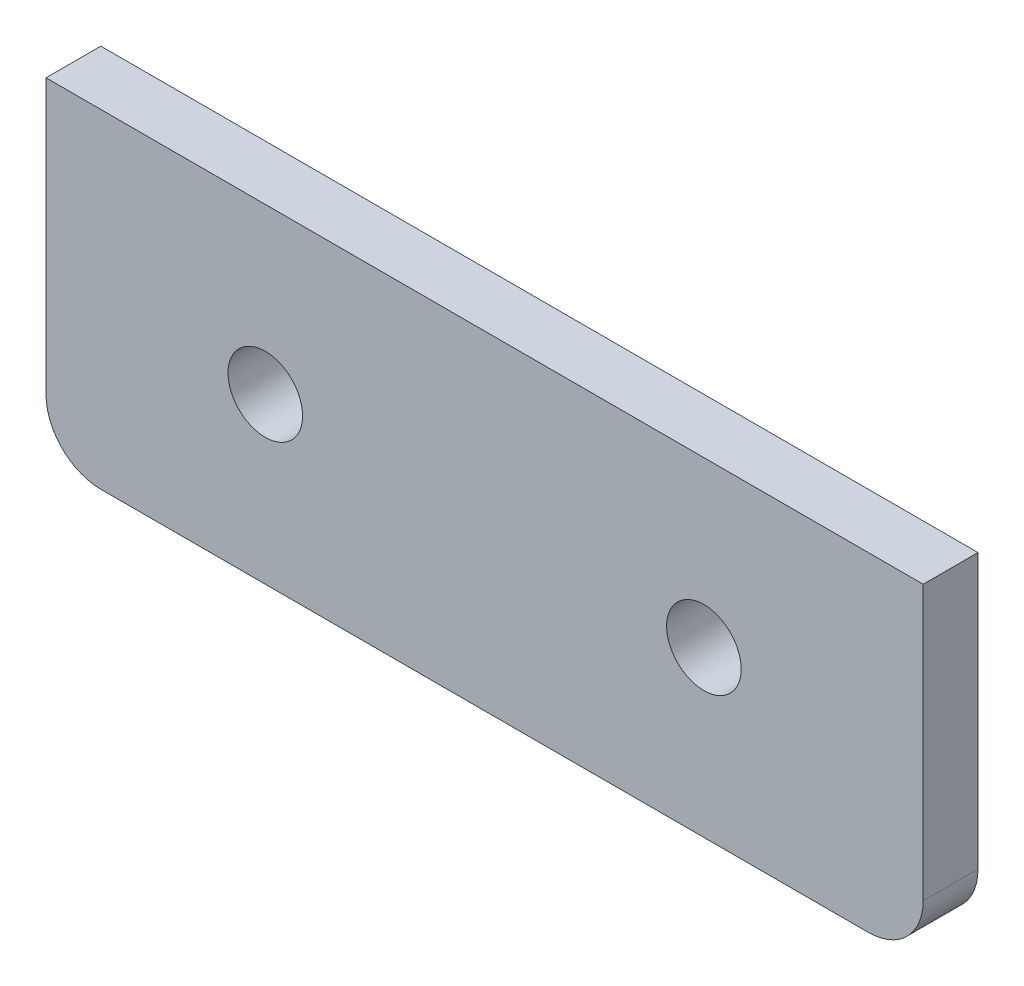
ISO-10303-21;
HEADER;
FILE_DESCRIPTION(('STEP AP214'),'2;1');
FILE_NAME('part.step','',(''),(''),'','','');
FILE_SCHEMA(('AUTOMOTIVE_DESIGN { 1 0 10303 214 1 1 1 1 }'));
ENDSEC;
DATA;
#1=APPLICATION_CONTEXT('core data for automotive mechanical design processes');
#2=APPLICATION_PROTOCOL_DEFINITION('international standard','automotive_design',2000,#1);
#3=PRODUCT_CONTEXT('',#1,'mechanical');
#4=PRODUCT('Part','Part','',(#3));
#5=PRODUCT_RELATED_PRODUCT_CATEGORY('part','',(#4));
#6=PRODUCT_DEFINITION_FORMATION('','',#4);
#7=PRODUCT_DEFINITION_CONTEXT('part definition',#1,'design');
#8=PRODUCT_DEFINITION('design','',#6,#7);
#9=PRODUCT_DEFINITION_SHAPE('','',#8);
#10=(LENGTH_UNIT() NAMED_UNIT(*) SI_UNIT(.MILLI.,.METRE.));
#11=(NAMED_UNIT(*) PLANE_ANGLE_UNIT() SI_UNIT($,.RADIAN.));
#12=(NAMED_UNIT(*) SI_UNIT($,.STERADIAN.) SOLID_ANGLE_UNIT());
#13=UNCERTAINTY_MEASURE_WITH_UNIT(LENGTH_MEASURE(1.E-05),#10,'distance_accuracy_value','');
#14=(GEOMETRIC_REPRESENTATION_CONTEXT(3) GLOBAL_UNCERTAINTY_ASSIGNED_CONTEXT((#13)) GLOBAL_UNIT_ASSIGNED_CONTEXT((#10,
#11,#12)) REPRESENTATION_CONTEXT('',''));
#15=CARTESIAN_POINT('',(0.,0.,0.));
#16=DIRECTION('',(0.,0.,1.));
#17=DIRECTION('',(1.,0.,0.));
#18=AXIS2_PLACEMENT_3D('',#15,#16,#17);
#19=CARTESIAN_POINT('',(40.,15.,5.));
#20=DIRECTION('',(-1.,0.,0.));
#21=DIRECTION('',(0.,-1.,0.));
#22=AXIS2_PLACEMENT_3D('',#19,#20,#21);
#23=PLANE('',#22);
#24=DIRECTION('',(0.,1.,0.));
#25=VECTOR('',#24,1.);
#26=CARTESIAN_POINT('',(40.,15.,5.));
#27=LINE('',#26,#25);
#28=CARTESIAN_POINT('',(40.,-10.,5.));
#29=VERTEX_POINT('',#28);
#30=CARTESIAN_POINT('',(40.,15.,5.));
#31=VERTEX_POINT('',#30);
#32=EDGE_CURVE('E99',#29,#31,#27,.T.);
#33=ORIENTED_EDGE('',*,*,#32,.F.);
#34=DIRECTION('',(0.,0.,-1.));
#35=VECTOR('',#34,1.);
#36=CARTESIAN_POINT('',(40.,-10.,5.));
#37=LINE('',#36,#35);
#38=CARTESIAN_POINT('',(40.,-10.,0.));
#39=VERTEX_POINT('',#38);
#40=EDGE_CURVE('E122',#29,#39,#37,.T.);
#41=ORIENTED_EDGE('',*,*,#40,.T.);
#42=DIRECTION('',(0.,1.,0.));
#43=VECTOR('',#42,1.);
#44=CARTESIAN_POINT('',(40.,15.,0.));
#45=LINE('',#44,#43);
#46=CARTESIAN_POINT('',(40.,15.,0.));
#47=VERTEX_POINT('',#46);
#48=EDGE_CURVE('E120',#39,#47,#45,.T.);
#49=ORIENTED_EDGE('',*,*,#48,.T.);
#50=DIRECTION('',(0.,0.,-1.));
#51=VECTOR('',#50,1.);
#52=CARTESIAN_POINT('',(40.,15.,5.));
#53=LINE('',#52,#51);
#54=EDGE_CURVE('E114',#31,#47,#53,.T.);
#55=ORIENTED_EDGE('',*,*,#54,.F.);
#56=EDGE_LOOP('',(#33,#41,#49,#55));
#57=FACE_BOUND('',#56,.T.);
#58=ADVANCED_FACE('F43',(#57),#23,.F.);
#59=CARTESIAN_POINT('',(-40.,15.,5.));
#60=DIRECTION('',(0.,-1.,0.));
#61=DIRECTION('',(0.,0.,-1.));
#62=AXIS2_PLACEMENT_3D('',#59,#60,#61);
#63=PLANE('',#62);
#64=DIRECTION('',(-1.,0.,0.));
#65=VECTOR('',#64,1.);
#66=CARTESIAN_POINT('',(-40.,15.,0.));
#67=LINE('',#66,#65);
#68=CARTESIAN_POINT('',(-40.,15.,0.));
#69=VERTEX_POINT('',#68);
#70=EDGE_CURVE('E156',#47,#69,#67,.T.);
#71=ORIENTED_EDGE('',*,*,#70,.T.);
#72=DIRECTION('',(0.,0.,-1.));
#73=VECTOR('',#72,1.);
#74=CARTESIAN_POINT('',(-40.,15.,5.));
#75=LINE('',#74,#73);
#76=CARTESIAN_POINT('',(-40.,15.,5.));
#77=VERTEX_POINT('',#76);
#78=EDGE_CURVE('E116',#77,#69,#75,.T.);
#79=ORIENTED_EDGE('',*,*,#78,.F.);
#80=DIRECTION('',(-1.,0.,0.));
#81=VECTOR('',#80,1.);
#82=CARTESIAN_POINT('',(-40.,15.,5.));
#83=LINE('',#82,#81);
#84=EDGE_CURVE('E102',#31,#77,#83,.T.);
#85=ORIENTED_EDGE('',*,*,#84,.F.);
#86=ORIENTED_EDGE('',*,*,#54,.T.);
#87=EDGE_LOOP('',(#71,#79,#85,#86));
#88=FACE_BOUND('',#87,.T.);
#89=ADVANCED_FACE('F113',(#88),#63,.F.);
#90=CARTESIAN_POINT('',(-40.,15.,5.));
#91=DIRECTION('',(1.,0.,0.));
#92=DIRECTION('',(0.,1.,0.));
#93=AXIS2_PLACEMENT_3D('',#90,#91,#92);
#94=PLANE('',#93);
#95=DIRECTION('',(0.,-1.,0.));
#96=VECTOR('',#95,1.);
#97=CARTESIAN_POINT('',(-40.,15.,0.));
#98=LINE('',#97,#96);
#99=CARTESIAN_POINT('',(-40.,-10.,0.));
#100=VERTEX_POINT('',#99);
#101=EDGE_CURVE('E158',#69,#100,#98,.T.);
#102=ORIENTED_EDGE('',*,*,#101,.T.);
#103=DIRECTION('',(0.,0.,-1.));
#104=VECTOR('',#103,1.);
#105=CARTESIAN_POINT('',(-40.,-10.,5.));
#106=LINE('',#105,#104);
#107=CARTESIAN_POINT('',(-40.,-10.,5.));
#108=VERTEX_POINT('',#107);
#109=EDGE_CURVE('E11',#100,#108,#106,.F.);
#110=ORIENTED_EDGE('',*,*,#109,.T.);
#111=DIRECTION('',(0.,-1.,0.));
#112=VECTOR('',#111,1.);
#113=CARTESIAN_POINT('',(-40.,15.,5.));
#114=LINE('',#113,#112);
#115=EDGE_CURVE('E117',#77,#108,#114,.T.);
#116=ORIENTED_EDGE('',*,*,#115,.F.);
#117=ORIENTED_EDGE('',*,*,#78,.T.);
#118=EDGE_LOOP('',(#102,#110,#116,#117));
#119=FACE_BOUND('',#118,.T.);
#120=ADVANCED_FACE('F167',(#119),#94,.F.);
#121=CARTESIAN_POINT('',(-40.,-15.,5.));
#122=DIRECTION('',(0.,1.,0.));
#123=DIRECTION('',(0.,0.,1.));
#124=AXIS2_PLACEMENT_3D('',#121,#122,#123);
#125=PLANE('',#124);
#126=DIRECTION('',(1.,0.,0.));
#127=VECTOR('',#126,1.);
#128=CARTESIAN_POINT('',(-40.,-15.,0.));
#129=LINE('',#128,#127);
#130=CARTESIAN_POINT('',(-35.,-15.,0.));
#131=VERTEX_POINT('',#130);
#132=CARTESIAN_POINT('',(35.,-15.,0.));
#133=VERTEX_POINT('',#132);
#134=EDGE_CURVE('E109',#131,#133,#129,.T.);
#135=ORIENTED_EDGE('',*,*,#134,.T.);
#136=DIRECTION('',(0.,0.,-1.));
#137=VECTOR('',#136,1.);
#138=CARTESIAN_POINT('',(35.,-15.,5.));
#139=LINE('',#138,#137);
#140=CARTESIAN_POINT('',(35.,-15.,5.));
#141=VERTEX_POINT('',#140);
#142=EDGE_CURVE('E66',#133,#141,#139,.F.);
#143=ORIENTED_EDGE('',*,*,#142,.T.);
#144=DIRECTION('',(1.,0.,0.));
#145=VECTOR('',#144,1.);
#146=CARTESIAN_POINT('',(-40.,-15.,5.));
#147=LINE('',#146,#145);
#148=CARTESIAN_POINT('',(-35.,-15.,5.));
#149=VERTEX_POINT('',#148);
#150=EDGE_CURVE('E126',#149,#141,#147,.T.);
#151=ORIENTED_EDGE('',*,*,#150,.F.);
#152=DIRECTION('',(0.,0.,-1.));
#153=VECTOR('',#152,1.);
#154=CARTESIAN_POINT('',(-35.,-15.,5.));
#155=LINE('',#154,#153);
#156=EDGE_CURVE('E133',#149,#131,#155,.T.);
#157=ORIENTED_EDGE('',*,*,#156,.T.);
#158=EDGE_LOOP('',(#135,#143,#151,#157));
#159=FACE_BOUND('',#158,.T.);
#160=ADVANCED_FACE('F160',(#159),#125,.F.);
#161=CARTESIAN_POINT('',(0.,0.,5.));
#162=DIRECTION('',(0.,0.,1.));
#163=DIRECTION('',(1.,0.,0.));
#164=AXIS2_PLACEMENT_3D('',#161,#162,#163);
#165=PLANE('',#164);
#166=CARTESIAN_POINT('',(-20.,0.,5.));
#167=DIRECTION('',(0.,0.,1.));
#168=DIRECTION('',(1.,0.,0.));
#169=AXIS2_PLACEMENT_3D('',#166,#167,#168);
#170=CIRCLE('',#169,3.4);
#171=CARTESIAN_POINT('',(-16.6,0.,5.));
#172=VERTEX_POINT('',#171);
#173=EDGE_CURVE('E141',#172,#172,#170,.T.);
#174=ORIENTED_EDGE('',*,*,#173,.F.);
#175=EDGE_LOOP('',(#174));
#176=FACE_BOUND('',#175,.T.);
#177=CARTESIAN_POINT('',(20.,0.,5.));
#178=DIRECTION('',(0.,0.,1.));
#179=DIRECTION('',(1.,0.,0.));
#180=AXIS2_PLACEMENT_3D('',#177,#178,#179);
#181=CIRCLE('',#180,3.4);
#182=CARTESIAN_POINT('',(23.4,0.,5.));
#183=VERTEX_POINT('',#182);
#184=EDGE_CURVE('E146',#183,#183,#181,.T.);
#185=ORIENTED_EDGE('',*,*,#184,.F.);
#186=EDGE_LOOP('',(#185));
#187=FACE_BOUND('',#186,.T.);
#188=ORIENTED_EDGE('',*,*,#150,.T.);
#189=CARTESIAN_POINT('',(35.,-10.,5.));
#190=DIRECTION('',(0.,0.,1.));
#191=DIRECTION('',(1.,0.,0.));
#192=AXIS2_PLACEMENT_3D('',#189,#190,#191);
#193=CIRCLE('',#192,5.);
#194=EDGE_CURVE('E52',#141,#29,#193,.T.);
#195=ORIENTED_EDGE('',*,*,#194,.T.);
#196=ORIENTED_EDGE('',*,*,#32,.T.);
#197=ORIENTED_EDGE('',*,*,#84,.T.);
#198=ORIENTED_EDGE('',*,*,#115,.T.);
#199=CARTESIAN_POINT('',(-35.,-10.,5.));
#200=DIRECTION('',(0.,0.,1.));
#201=DIRECTION('',(1.,0.,0.));
#202=AXIS2_PLACEMENT_3D('',#199,#200,#201);
#203=CIRCLE('',#202,5.);
#204=EDGE_CURVE('E137',#108,#149,#203,.T.);
#205=ORIENTED_EDGE('',*,*,#204,.T.);
#206=EDGE_LOOP('',(#188,#195,#196,#197,#198,#205));
#207=FACE_BOUND('',#206,.T.);
#208=ADVANCED_FACE('F101',(#176,#187,#207),#165,.T.);
#209=CARTESIAN_POINT('',(0.,0.,0.));
#210=DIRECTION('',(0.,0.,1.));
#211=DIRECTION('',(1.,0.,0.));
#212=AXIS2_PLACEMENT_3D('',#209,#210,#211);
#213=PLANE('',#212);
#214=CARTESIAN_POINT('',(-20.,0.,0.));
#215=DIRECTION('',(0.,0.,1.));
#216=DIRECTION('',(1.,0.,0.));
#217=AXIS2_PLACEMENT_3D('',#214,#215,#216);
#218=CIRCLE('',#217,3.4);
#219=CARTESIAN_POINT('',(-16.6,0.,0.));
#220=VERTEX_POINT('',#219);
#221=EDGE_CURVE('E47',#220,#220,#218,.T.);
#222=ORIENTED_EDGE('',*,*,#221,.T.);
#223=EDGE_LOOP('',(#222));
#224=FACE_BOUND('',#223,.T.);
#225=CARTESIAN_POINT('',(20.,0.,0.));
#226=DIRECTION('',(0.,0.,1.));
#227=DIRECTION('',(1.,0.,0.));
#228=AXIS2_PLACEMENT_3D('',#225,#226,#227);
#229=CIRCLE('',#228,3.4);
#230=CARTESIAN_POINT('',(23.4,0.,0.));
#231=VERTEX_POINT('',#230);
#232=EDGE_CURVE('E139',#231,#231,#229,.T.);
#233=ORIENTED_EDGE('',*,*,#232,.T.);
#234=EDGE_LOOP('',(#233));
#235=FACE_BOUND('',#234,.T.);
#236=ORIENTED_EDGE('',*,*,#48,.F.);
#237=CARTESIAN_POINT('',(35.,-10.,0.));
#238=DIRECTION('',(0.,0.,1.));
#239=DIRECTION('',(1.,0.,0.));
#240=AXIS2_PLACEMENT_3D('',#237,#238,#239);
#241=CIRCLE('',#240,5.);
#242=EDGE_CURVE('E131',#39,#133,#241,.F.);
#243=ORIENTED_EDGE('',*,*,#242,.T.);
#244=ORIENTED_EDGE('',*,*,#134,.F.);
#245=CARTESIAN_POINT('',(-35.,-10.,0.));
#246=DIRECTION('',(0.,0.,1.));
#247=DIRECTION('',(1.,0.,0.));
#248=AXIS2_PLACEMENT_3D('',#245,#246,#247);
#249=CIRCLE('',#248,5.);
#250=EDGE_CURVE('E124',#131,#100,#249,.F.);
#251=ORIENTED_EDGE('',*,*,#250,.T.);
#252=ORIENTED_EDGE('',*,*,#101,.F.);
#253=ORIENTED_EDGE('',*,*,#70,.F.);
#254=EDGE_LOOP('',(#236,#243,#244,#251,#252,#253));
#255=FACE_BOUND('',#254,.T.);
#256=ADVANCED_FACE('F165',(#224,#235,#255),#213,.F.);
#257=CARTESIAN_POINT('',(35.,-10.,5.));
#258=DIRECTION('',(0.,0.,-1.));
#259=DIRECTION('',(-1.,0.,0.));
#260=AXIS2_PLACEMENT_3D('',#257,#258,#259);
#261=CYLINDRICAL_SURFACE('',#260,5.);
#262=ORIENTED_EDGE('',*,*,#194,.F.);
#263=ORIENTED_EDGE('',*,*,#142,.F.);
#264=ORIENTED_EDGE('',*,*,#242,.F.);
#265=ORIENTED_EDGE('',*,*,#40,.F.);
#266=EDGE_LOOP('',(#262,#263,#264,#265));
#267=FACE_BOUND('',#266,.T.);
#268=ADVANCED_FACE('F164',(#267),#261,.T.);
#269=CARTESIAN_POINT('',(-35.,-10.,5.));
#270=DIRECTION('',(0.,0.,-1.));
#271=DIRECTION('',(-1.,0.,0.));
#272=AXIS2_PLACEMENT_3D('',#269,#270,#271);
#273=CYLINDRICAL_SURFACE('',#272,5.);
#274=ORIENTED_EDGE('',*,*,#204,.F.);
#275=ORIENTED_EDGE('',*,*,#109,.F.);
#276=ORIENTED_EDGE('',*,*,#250,.F.);
#277=ORIENTED_EDGE('',*,*,#156,.F.);
#278=EDGE_LOOP('',(#274,#275,#276,#277));
#279=FACE_BOUND('',#278,.T.);
#280=ADVANCED_FACE('F45',(#279),#273,.T.);
#281=CARTESIAN_POINT('',(20.,0.,-3.));
#282=DIRECTION('',(0.,0.,1.));
#283=DIRECTION('',(1.,0.,0.));
#284=AXIS2_PLACEMENT_3D('',#281,#282,#283);
#285=CYLINDRICAL_SURFACE('',#284,3.4);
#286=ORIENTED_EDGE('',*,*,#184,.T.);
#287=EDGE_LOOP('',(#286));
#288=FACE_BOUND('',#287,.T.);
#289=ORIENTED_EDGE('',*,*,#232,.F.);
#290=EDGE_LOOP('',(#289));
#291=FACE_BOUND('',#290,.T.);
#292=ADVANCED_FACE('F171',(#288,#291),#285,.F.);
#293=CARTESIAN_POINT('',(-20.,0.,-3.));
#294=DIRECTION('',(0.,0.,1.));
#295=DIRECTION('',(1.,0.,0.));
#296=AXIS2_PLACEMENT_3D('',#293,#294,#295);
#297=CYLINDRICAL_SURFACE('',#296,3.4);
#298=ORIENTED_EDGE('',*,*,#173,.T.);
#299=EDGE_LOOP('',(#298));
#300=FACE_BOUND('',#299,.T.);
#301=ORIENTED_EDGE('',*,*,#221,.F.);
#302=EDGE_LOOP('',(#301));
#303=FACE_BOUND('',#302,.T.);
#304=ADVANCED_FACE('F176',(#300,#303),#297,.F.);
#305=CLOSED_SHELL('',(#58,#89,#120,#160,#208,#256,#268,#280,#292,#304));
#306=MANIFOLD_SOLID_BREP('B2',#305);
#307=ADVANCED_BREP_SHAPE_REPRESENTATION('',(#18,#306),#14);
#308=SHAPE_DEFINITION_REPRESENTATION(#9,#307);
ENDSEC;
END-ISO-10303-21;
